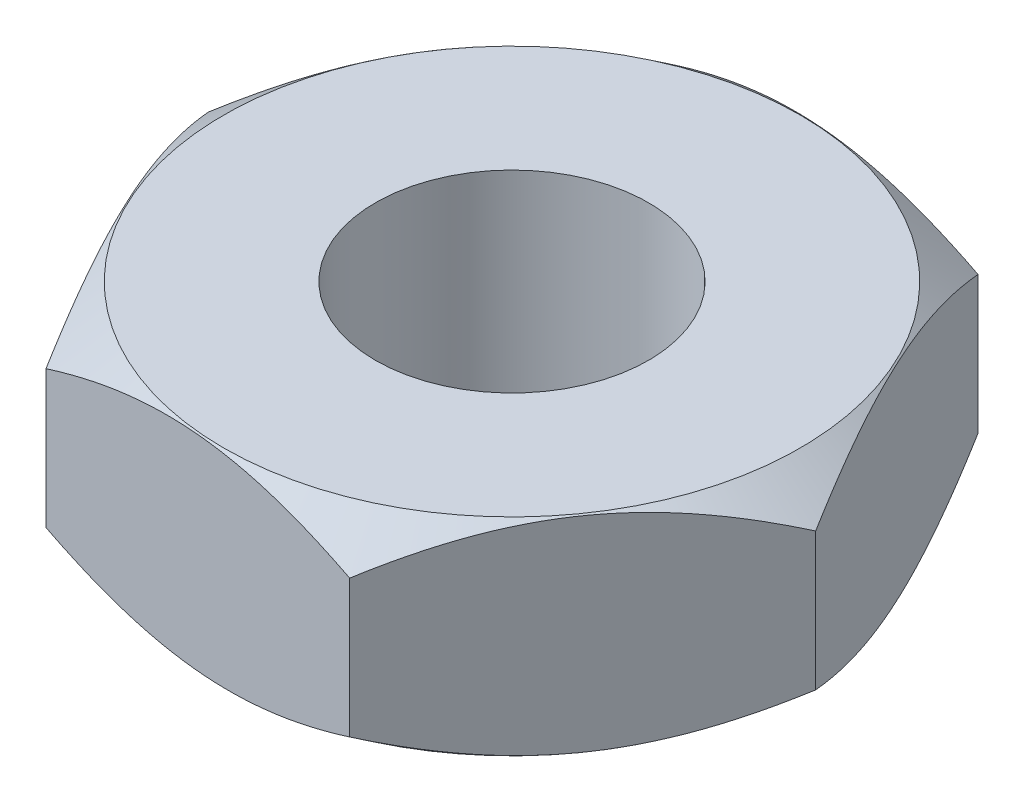
ISO-10303-21;
HEADER;
FILE_DESCRIPTION(('STEP AP214'),'2;1');
FILE_NAME('part.step','',(''),(''),'','','');
FILE_SCHEMA(('AUTOMOTIVE_DESIGN { 1 0 10303 214 1 1 1 1 }'));
ENDSEC;
DATA;
#1=APPLICATION_CONTEXT('core data for automotive mechanical design processes');
#2=APPLICATION_PROTOCOL_DEFINITION('international standard','automotive_design',2000,#1);
#3=PRODUCT_CONTEXT('',#1,'mechanical');
#4=PRODUCT('Part','Part','',(#3));
#5=PRODUCT_RELATED_PRODUCT_CATEGORY('part','',(#4));
#6=PRODUCT_DEFINITION_FORMATION('','',#4);
#7=PRODUCT_DEFINITION_CONTEXT('part definition',#1,'design');
#8=PRODUCT_DEFINITION('design','',#6,#7);
#9=PRODUCT_DEFINITION_SHAPE('','',#8);
#10=(LENGTH_UNIT() NAMED_UNIT(*) SI_UNIT(.MILLI.,.METRE.));
#11=(NAMED_UNIT(*) PLANE_ANGLE_UNIT() SI_UNIT($,.RADIAN.));
#12=(NAMED_UNIT(*) SI_UNIT($,.STERADIAN.) SOLID_ANGLE_UNIT());
#13=UNCERTAINTY_MEASURE_WITH_UNIT(LENGTH_MEASURE(1.E-05),#10,'distance_accuracy_value','');
#14=(GEOMETRIC_REPRESENTATION_CONTEXT(3) GLOBAL_UNCERTAINTY_ASSIGNED_CONTEXT((#13)) GLOBAL_UNIT_ASSIGNED_CONTEXT((#10,
#11,#12)) REPRESENTATION_CONTEXT('',''));
#15=CARTESIAN_POINT('',(0.,0.,0.));
#16=DIRECTION('',(0.,0.,1.));
#17=DIRECTION('',(1.,0.,0.));
#18=AXIS2_PLACEMENT_3D('',#15,#16,#17);
#19=CARTESIAN_POINT('',(3.40734499371523,2.5,7.32962027850947));
#20=DIRECTION('',(-0.818475346561115,0.,-0.574541649553505));
#21=DIRECTION('',(-0.574541649553505,0.,0.818475346561115));
#22=AXIS2_PLACEMENT_3D('',#19,#20,#21);
#23=PLANE('',#22);
#24=CARTESIAN_POINT('',(8.0514502512877,-1.66273053763889,0.713762815239612));
#25=CARTESIAN_POINT('',(7.88019641403909,-1.77446343527246,0.957726057766775));
#26=CARTESIAN_POINT('',(7.70704591768586,-1.8782622042377,1.20439122576648));
#27=CARTESIAN_POINT('',(7.35658310687575,-2.06541723281908,1.70365036695755));
#28=CARTESIAN_POINT('',(7.1792596256447,-2.14870960646448,1.95626024801108));
#29=CARTESIAN_POINT('',(6.82286729872538,-2.28884993232861,2.46396640563029));
#30=CARTESIAN_POINT('',(6.643831838476,-2.34594546032983,2.7190151222694));
#31=CARTESIAN_POINT('',(6.37369059270988,-2.40930570053764,3.10385049481499));
#32=CARTESIAN_POINT('',(6.28341903433959,-2.42670916570008,3.2324487349585));
#33=CARTESIAN_POINT('',(6.10249673979514,-2.45375184515626,3.49018538093183));
#34=CARTESIAN_POINT('',(6.01184605630044,-2.46339210433136,3.619323711716));
#35=CARTESIAN_POINT('',(5.82911458608083,-2.47475479490065,3.87963765680919));
#36=CARTESIAN_POINT('',(5.7370314903531,-2.47636489592613,4.01081656045654));
#37=CARTESIAN_POINT('',(5.55293982232168,-2.4713264553074,4.27306820384588));
#38=CARTESIAN_POINT('',(5.46093125056886,-2.46467785316496,4.40414094280312));
#39=CARTESIAN_POINT('',(5.27718251743575,-2.44327766029834,4.66590405109677));
#40=CARTESIAN_POINT('',(5.18544250594723,-2.42852218494007,4.79659420690173));
#41=CARTESIAN_POINT('',(5.00247965586308,-2.39125597120719,5.05723776902958));
#42=CARTESIAN_POINT('',(4.91125688795054,-2.36874419768933,5.18719107465939));
#43=CARTESIAN_POINT('',(4.63871916450914,-2.29030427125252,5.57544039969618));
#44=CARTESIAN_POINT('',(4.45842199572954,-2.22345735283203,5.83228650966149));
#45=CARTESIAN_POINT('',(4.10151061186007,-2.06552383107109,6.34073210073602));
#46=CARTESIAN_POINT('',(3.92489544405616,-1.97444358417538,6.59233293905401));
#47=CARTESIAN_POINT('',(3.69255100903755,-1.84052134885221,6.92332407280592));
#48=CARTESIAN_POINT('',(3.63514056802983,-1.80626466591005,7.00510931959618));
#49=CARTESIAN_POINT('',(3.52082586776328,-1.73587705774643,7.16795872135914));
#50=CARTESIAN_POINT('',(3.46392083970468,-1.69974991790392,7.24902397154166));
#51=CARTESIAN_POINT('',(3.40720460056791,-1.66273053763889,7.32982027850947));
#52=B_SPLINE_CURVE_WITH_KNOTS('',3,(#24,#25,#26,#27,#28,#29,#30,#31,#32,#33,#34,#35,#36,#37,#38,
#39,#40,#41,#42,#43,#44,#45,#46,#47,#48,#49,#50,#51),.UNSPECIFIED.,.F.,.F.,(4,2,2,2,2,2,2,2,2,2,
2,2,2,4),(0.,0.95530913231467,1.91355782379117,2.86255387843774,3.33663353388783,
3.81064937036481,4.29127776554733,4.77190968154199,5.25277210682606,5.73369873212081,
6.69496390420939,7.65597718290046,7.97286405319337,8.28913293956906),.UNSPECIFIED.);
#53=CARTESIAN_POINT('',(8.05130985814038,-1.66282217350893,0.713962815239612));
#54=VERTEX_POINT('',#53);
#55=CARTESIAN_POINT('',(3.40734499371523,-1.66282217350893,7.32962027850947));
#56=VERTEX_POINT('',#55);
#57=EDGE_CURVE('E56',#54,#56,#52,.T.);
#58=ORIENTED_EDGE('',*,*,#57,.F.);
#59=DIRECTION('',(0.,-1.,0.));
#60=VECTOR('',#59,1.);
#61=CARTESIAN_POINT('',(8.05130985814038,2.5,0.713962815239612));
#62=LINE('',#61,#60);
#63=CARTESIAN_POINT('',(8.05130985814038,1.66282217350893,0.713962815239612));
#64=VERTEX_POINT('',#63);
#65=EDGE_CURVE('E49',#64,#54,#62,.T.);
#66=ORIENTED_EDGE('',*,*,#65,.F.);
#67=CARTESIAN_POINT('',(3.40720460056791,1.66273053763889,7.32982027850947));
#68=CARTESIAN_POINT('',(3.57845843781652,1.77446343527246,7.0858570359823));
#69=CARTESIAN_POINT('',(3.75160893416975,1.8782622042377,6.8391918679826));
#70=CARTESIAN_POINT('',(4.10207174497986,2.06541723281908,6.33993272679153));
#71=CARTESIAN_POINT('',(4.27939522621091,2.14870960646448,6.087322845738));
#72=CARTESIAN_POINT('',(4.63578755313023,2.28884993232861,5.57961668811879));
#73=CARTESIAN_POINT('',(4.81482301337961,2.34594546032983,5.32456797147967));
#74=CARTESIAN_POINT('',(5.08496425914574,2.40930570053764,4.93973259893409));
#75=CARTESIAN_POINT('',(5.17523581751602,2.42670916570008,4.81113435879058));
#76=CARTESIAN_POINT('',(5.35615811206048,2.45375184515626,4.55339771281724));
#77=CARTESIAN_POINT('',(5.44680879555517,2.46339210433136,4.42425938203307));
#78=CARTESIAN_POINT('',(5.62954026577478,2.47475479490065,4.16394543693989));
#79=CARTESIAN_POINT('',(5.72162336150251,2.47636489592613,4.03276653329253));
#80=CARTESIAN_POINT('',(5.90571502953393,2.4713264553074,3.77051488990319));
#81=CARTESIAN_POINT('',(5.99772360128676,2.46467785316496,3.63944215094595));
#82=CARTESIAN_POINT('',(6.18147233441986,2.44327766029834,3.37767904265231));
#83=CARTESIAN_POINT('',(6.27321234590838,2.42852218494007,3.24698888684734));
#84=CARTESIAN_POINT('',(6.45617519599253,2.39125597120719,2.98634532471949));
#85=CARTESIAN_POINT('',(6.54739796390508,2.36874419768933,2.85639201908969));
#86=CARTESIAN_POINT('',(6.81993568734647,2.29030427125252,2.46814269405289));
#87=CARTESIAN_POINT('',(7.00023285612607,2.22345735283203,2.21129658408759));
#88=CARTESIAN_POINT('',(7.35714423999554,2.06552383107109,1.70285099301305));
#89=CARTESIAN_POINT('',(7.53375940779946,1.97444358417538,1.45125015469506));
#90=CARTESIAN_POINT('',(7.76610384281807,1.84052134885221,1.12025902094316));
#91=CARTESIAN_POINT('',(7.82351428382579,1.80626466591005,1.03847377415289));
#92=CARTESIAN_POINT('',(7.93782898409233,1.73587705774644,0.875624372389939));
#93=CARTESIAN_POINT('',(7.99473401215093,1.69974991790392,0.794559122207422));
#94=CARTESIAN_POINT('',(8.0514502512877,1.66273053763889,0.713762815239613));
#95=B_SPLINE_CURVE_WITH_KNOTS('',3,(#67,#68,#69,#70,#71,#72,#73,#74,#75,#76,#77,#78,#79,#80,#81,
#82,#83,#84,#85,#86,#87,#88,#89,#90,#91,#92,#93,#94),.UNSPECIFIED.,.F.,.F.,(4,2,2,2,2,2,2,2,2,2,
2,2,2,4),(0.,0.955309132314671,1.91355782379117,2.86255387843774,3.33663353388783,
3.81064937036482,4.29127776554733,4.771909681542,5.25277210682606,5.73369873212082,
6.6949639042094,7.65597718290047,7.97286405319337,8.28913293956906),.UNSPECIFIED.);
#96=CARTESIAN_POINT('',(3.40734499371523,1.66282217350893,7.32962027850947));
#97=VERTEX_POINT('',#96);
#98=EDGE_CURVE('E174',#97,#64,#95,.T.);
#99=ORIENTED_EDGE('',*,*,#98,.F.);
#100=DIRECTION('',(0.,-1.,0.));
#101=VECTOR('',#100,1.);
#102=CARTESIAN_POINT('',(3.40734499371523,2.5,7.32962027850947));
#103=LINE('',#102,#101);
#104=EDGE_CURVE('E110',#97,#56,#103,.T.);
#105=ORIENTED_EDGE('',*,*,#104,.T.);
#106=EDGE_LOOP('',(#58,#66,#99,#105));
#107=FACE_BOUND('',#106,.T.);
#108=ADVANCED_FACE('F40',(#107),#23,.F.);
#109=CARTESIAN_POINT('',(8.05130985814038,2.5,0.713962815239612));
#110=DIRECTION('',(-0.906805337326109,0.,0.421549617716446));
#111=DIRECTION('',(0.421549617716446,0.,0.906805337326109));
#112=AXIS2_PLACEMENT_3D('',#109,#110,#111);
#113=PLANE('',#112);
#114=CARTESIAN_POINT('',(4.64387188975895,-1.66273946387792,-6.61585746326985));
#115=CARTESIAN_POINT('',(4.76952314301071,-1.77447169895915,-6.34556608521657));
#116=CARTESIAN_POINT('',(4.89656600109973,-1.87826977929504,-6.07228119313591));
#117=CARTESIAN_POINT('',(5.15370528779027,-2.06542339709618,-5.51914280133679));
#118=CARTESIAN_POINT('',(5.28380990950613,-2.14871504907758,-5.2392716772166));
#119=CARTESIAN_POINT('',(5.54529973900327,-2.28885393785498,-4.67677473005058));
#120=CARTESIAN_POINT('',(5.67666045171261,-2.34594874936512,-4.39420159893245));
#121=CARTESIAN_POINT('',(5.87486668002113,-2.40930795106098,-3.96783550068978));
#122=CARTESIAN_POINT('',(5.94110012134438,-2.42671107625242,-3.82535918099401));
#123=CARTESIAN_POINT('',(6.07384520527462,-2.45375309572196,-3.53980809625146));
#124=CARTESIAN_POINT('',(6.14035680923105,-2.4633930348733,-3.39673341434678));
#125=CARTESIAN_POINT('',(6.2744292812909,-2.47475510785177,-3.10832695365311));
#126=CARTESIAN_POINT('',(6.3419918434209,-2.47636491351762,-2.96299153080349));
#127=CARTESIAN_POINT('',(6.4770622828807,-2.47132592208718,-2.67243831886933));
#128=CARTESIAN_POINT('',(6.54457015980628,-2.46467706449165,-2.52722053065432));
#129=CARTESIAN_POINT('',(6.67938897286209,-2.44327640588762,-2.2372085982198));
#130=CARTESIAN_POINT('',(6.74669979901192,-2.42852072024598,-2.09241469058174));
#131=CARTESIAN_POINT('',(6.8809419915655,-2.39125413379618,-1.80364314012613));
#132=CARTESIAN_POINT('',(6.94787330610801,-2.36874219785693,-1.65966560886852));
#133=CARTESIAN_POINT('',(7.14783772001708,-2.29030185903239,-1.22951743606197));
#134=CARTESIAN_POINT('',(7.28012405332108,-2.22345476427954,-0.944953180624642));
#135=CARTESIAN_POINT('',(7.54199449163573,-2.06552106097245,-0.381637496843428));
#136=CARTESIAN_POINT('',(7.67157929568642,-1.97444080902164,-0.102884564777981));
#137=CARTESIAN_POINT('',(7.84205120137609,-1.84052036524651,0.263821577148893));
#138=CARTESIAN_POINT('',(7.88417181465702,-1.80626552787041,0.354428223032001));
#139=CARTESIAN_POINT('',(7.9680416877182,-1.73588180872621,0.534842687513617));
#140=CARTESIAN_POINT('',(8.0097915114898,-1.69975671175042,0.624651719327219));
#141=CARTESIAN_POINT('',(8.05140283280658,-1.66273946387792,0.714162815239612));
#142=B_SPLINE_CURVE_WITH_KNOTS('',3,(#114,#115,#116,#117,#118,#119,#120,#121,#122,#123,#124,
#125,#126,#127,#128,#129,#130,#131,#132,#133,#134,#135,#136,#137,#138,#139,#140,#141),
.UNSPECIFIED.,.F.,.F.,(4,2,2,2,2,2,2,2,2,2,2,2,2,4),(0.,0.955307141932442,1.91355381046055,
2.86254790318337,3.33662658155427,3.81064144141715,4.2912687402959,4.77189956005428,
5.2527608898098,5.73368641907198,6.69494936078008,7.65596040161594,7.97283021351268,
8.28908210533192),.UNSPECIFIED.);
#143=CARTESIAN_POINT('',(4.64396486442515,-1.66282217350893,-6.61565746326985));
#144=VERTEX_POINT('',#143);
#145=EDGE_CURVE('E188',#144,#54,#142,.T.);
#146=ORIENTED_EDGE('',*,*,#145,.F.);
#147=DIRECTION('',(0.,-1.,0.));
#148=VECTOR('',#147,1.);
#149=CARTESIAN_POINT('',(4.64396486442515,2.5,-6.61565746326985));
#150=LINE('',#149,#148);
#151=CARTESIAN_POINT('',(4.64396486442515,1.66282217350893,-6.61565746326985));
#152=VERTEX_POINT('',#151);
#153=EDGE_CURVE('E120',#152,#144,#150,.T.);
#154=ORIENTED_EDGE('',*,*,#153,.F.);
#155=CARTESIAN_POINT('',(8.05140283280658,1.66273946387792,0.714162815239612));
#156=CARTESIAN_POINT('',(7.92575157955481,1.77447169895915,0.443871437186323));
#157=CARTESIAN_POINT('',(7.7987087214658,1.87826977929505,0.170586545105668));
#158=CARTESIAN_POINT('',(7.54156943477526,2.06542339709618,-0.382551846693458));
#159=CARTESIAN_POINT('',(7.4114648130594,2.14871504907758,-0.662422970813643));
#160=CARTESIAN_POINT('',(7.14997498356226,2.28885393785498,-1.22491991797966));
#161=CARTESIAN_POINT('',(7.01861427085292,2.34594874936512,-1.5074930490978));
#162=CARTESIAN_POINT('',(6.82040804254439,2.40930795106099,-1.93385914734046));
#163=CARTESIAN_POINT('',(6.75417460122115,2.42671107625242,-2.07633546703623));
#164=CARTESIAN_POINT('',(6.62142951729091,2.45375309572196,-2.36188655177878));
#165=CARTESIAN_POINT('',(6.55491791333447,2.4633930348733,-2.50496123368346));
#166=CARTESIAN_POINT('',(6.42084544127463,2.47475510785177,-2.79336769437714));
#167=CARTESIAN_POINT('',(6.35328287914462,2.47636491351762,-2.93870311722676));
#168=CARTESIAN_POINT('',(6.21821243968482,2.47132592208718,-3.22925632916092));
#169=CARTESIAN_POINT('',(6.15070456275925,2.46467706449165,-3.37447411737592));
#170=CARTESIAN_POINT('',(6.01588574970344,2.44327640588762,-3.66448604981045));
#171=CARTESIAN_POINT('',(5.94857492355361,2.42852072024598,-3.8092799574485));
#172=CARTESIAN_POINT('',(5.81433273100003,2.39125413379618,-4.09805150790411));
#173=CARTESIAN_POINT('',(5.74740141645752,2.36874219785693,-4.24202903916172));
#174=CARTESIAN_POINT('',(5.54743700254845,2.29030185903239,-4.67217721196828));
#175=CARTESIAN_POINT('',(5.41515066924445,2.22345476427954,-4.9567414674056));
#176=CARTESIAN_POINT('',(5.1532802309298,2.06552106097245,-5.52005715118682));
#177=CARTESIAN_POINT('',(5.02369542687911,1.97444080902164,-5.79881008325227));
#178=CARTESIAN_POINT('',(4.85322352118943,1.84052036524651,-6.16551622517914));
#179=CARTESIAN_POINT('',(4.81110290790851,1.8062655278704,-6.25612287106225));
#180=CARTESIAN_POINT('',(4.72723303484733,1.73588180872621,-6.43653733554386));
#181=CARTESIAN_POINT('',(4.68548321107573,1.69975671175042,-6.52634636735746));
#182=CARTESIAN_POINT('',(4.64387188975895,1.66273946387792,-6.61585746326985));
#183=B_SPLINE_CURVE_WITH_KNOTS('',3,(#155,#156,#157,#158,#159,#160,#161,#162,#163,#164,#165,
#166,#167,#168,#169,#170,#171,#172,#173,#174,#175,#176,#177,#178,#179,#180,#181,#182),
.UNSPECIFIED.,.F.,.F.,(4,2,2,2,2,2,2,2,2,2,2,2,2,4),(0.,0.955307141932444,1.91355381046055,
2.86254790318338,3.33662658155427,3.81064144141715,4.2912687402959,4.77189956005428,
5.2527608898098,5.73368641907198,6.69494936078009,7.65596040161595,7.97283021351269,
8.28908210533192),.UNSPECIFIED.);
#184=EDGE_CURVE('E169',#64,#152,#183,.T.);
#185=ORIENTED_EDGE('',*,*,#184,.F.);
#186=ORIENTED_EDGE('',*,*,#65,.T.);
#187=EDGE_LOOP('',(#146,#154,#185,#186));
#188=FACE_BOUND('',#187,.T.);
#189=ADVANCED_FACE('F180',(#188),#113,.F.);
#190=CARTESIAN_POINT('',(4.64396486442515,2.5,-6.61565746326985));
#191=DIRECTION('',(-0.0883299907649943,0.,0.996091267269951));
#192=DIRECTION('',(0.996091267269951,0.,0.0883299907649943));
#193=AXIS2_PLACEMENT_3D('',#190,#191,#192);
#194=PLANE('',#193);
#195=CARTESIAN_POINT('',(-3.40754499371523,-1.66274687780085,-7.32963801383025));
#196=CARTESIAN_POINT('',(-3.11064054750935,-1.77447856257912,-7.3033095358552));
#197=CARTESIAN_POINT('',(-2.81044784304438,-1.87827607095302,-7.27668946630497));
#198=CARTESIAN_POINT('',(-2.20284709985687,-2.06542851698825,-7.22280949586646));
#199=CARTESIAN_POINT('',(-1.89541970161603,-2.14871956957011,-7.19554787824186));
#200=CARTESIAN_POINT('',(-1.27753899911836,-2.28885726473307,-7.14075631592341));
#201=CARTESIAN_POINT('',(-0.967143574330733,-2.34595148114091,-7.11323150378432));
#202=CARTESIAN_POINT('',(-0.498797289823525,-2.40930982027138,-7.07170014582079));
#203=CARTESIAN_POINT('',(-0.342292696968079,-2.4267126630904,-7.05782185003019));
#204=CARTESIAN_POINT('',(-0.0286261555177719,-2.45375413438985,-7.03000696637447));
#205=CARTESIAN_POINT('',(0.128535701750904,-2.46339380773675,-7.01607038660784));
#206=CARTESIAN_POINT('',(0.445338705432133,-2.47475536775868,-6.98797737213319));
#207=CARTESIAN_POINT('',(0.604983854466522,-2.47636492810586,-6.97382058248627));
#208=CARTESIAN_POINT('',(0.924144924779663,-2.47132547918452,-6.94551846267091));
#209=CARTESIAN_POINT('',(1.08366084510316,-2.46467640941592,-6.93137313258719));
#210=CARTESIAN_POINT('',(1.40222732069387,-2.44327536398201,-6.90312373941252));
#211=CARTESIAN_POINT('',(1.56127761608014,-2.42851950368433,-6.88901969936693));
#212=CARTESIAN_POINT('',(1.87848156615004,-2.39125260766544,-6.86089113032818));
#213=CARTESIAN_POINT('',(2.03663509828926,-2.36874053682323,-6.84686661220185));
#214=CARTESIAN_POINT('',(2.5091355633853,-2.2902998554805,-6.80496687561167));
#215=CARTESIAN_POINT('',(2.82171794011343,-2.22345261427107,-6.77724813200159));
#216=CARTESIAN_POINT('',(3.44049754063646,-2.06551876017769,-6.72237685845899));
#217=CARTESIAN_POINT('',(3.74669641625132,-1.97443850402898,-6.69522418204868));
#218=CARTESIAN_POINT('',(4.1495040871214,-1.84051954828221,-6.6595045657674));
#219=CARTESIAN_POINT('',(4.24902760047687,-1.80626624379524,-6.65067915859393));
#220=CARTESIAN_POINT('',(4.4471972231511,-1.73588575478284,-6.63310614945724));
#221=CARTESIAN_POINT('',(4.54584466496735,-1.69976235456249,-6.62435842933265));
#222=CARTESIAN_POINT('',(4.64416486442515,-1.66274687780086,-6.61563972794907));
#223=B_SPLINE_CURVE_WITH_KNOTS('',3,(#195,#196,#197,#198,#199,#200,#201,#202,#203,#204,#205,
#206,#207,#208,#209,#210,#211,#212,#213,#214,#215,#216,#217,#218,#219,#220,#221,#222),
.UNSPECIFIED.,.F.,.F.,(4,2,2,2,2,2,2,2,2,2,2,2,2,4),(0.,0.955305488762649,1.91355047707196,
2.86254294026276,3.33662080709258,3.81063485580068,4.29126124411332,4.77189115336163,
5.25275157319488,5.73367619211612,6.69493728131803,7.65594646343942,7.97280210698136,
8.28903988346751),.UNSPECIFIED.);
#224=CARTESIAN_POINT('',(-3.40734499371523,-1.66282217350892,-7.32962027850947));
#225=VERTEX_POINT('',#224);
#226=EDGE_CURVE('E194',#225,#144,#223,.T.);
#227=ORIENTED_EDGE('',*,*,#226,.F.);
#228=DIRECTION('',(0.,-1.,0.));
#229=VECTOR('',#228,1.);
#230=CARTESIAN_POINT('',(-3.40734499371523,2.5,-7.32962027850947));
#231=LINE('',#230,#229);
#232=CARTESIAN_POINT('',(-3.40734499371523,1.66282217350892,-7.32962027850947));
#233=VERTEX_POINT('',#232);
#234=EDGE_CURVE('E112',#233,#225,#231,.T.);
#235=ORIENTED_EDGE('',*,*,#234,.F.);
#236=CARTESIAN_POINT('',(4.64416486442515,1.66274687780086,-6.61563972794907));
#237=CARTESIAN_POINT('',(4.34726041821926,1.77447856257912,-6.64196820592412));
#238=CARTESIAN_POINT('',(4.0470677137543,1.87827607095303,-6.66858827547435));
#239=CARTESIAN_POINT('',(3.43946697056678,2.06542851698825,-6.72246824591286));
#240=CARTESIAN_POINT('',(3.13203957232594,2.14871956957012,-6.74972986353746));
#241=CARTESIAN_POINT('',(2.51415886982828,2.28885726473307,-6.80452142585591));
#242=CARTESIAN_POINT('',(2.20376344504065,2.34595148114091,-6.832046237995));
#243=CARTESIAN_POINT('',(1.73541716053344,2.40930982027138,-6.87357759595853));
#244=CARTESIAN_POINT('',(1.57891256767799,2.4267126630904,-6.88745589174913));
#245=CARTESIAN_POINT('',(1.26524602622768,2.45375413438985,-6.91527077540485));
#246=CARTESIAN_POINT('',(1.10808416895901,2.46339380773675,-6.92920735517148));
#247=CARTESIAN_POINT('',(0.79128116527778,2.47475536775868,-6.95730036964613));
#248=CARTESIAN_POINT('',(0.631636016243392,2.47636492810586,-6.97145715929306));
#249=CARTESIAN_POINT('',(0.31247494593025,2.47132547918452,-6.99975927910841));
#250=CARTESIAN_POINT('',(0.152959025606751,2.46467640941592,-7.01390460919213));
#251=CARTESIAN_POINT('',(-0.165607449983955,2.44327536398201,-7.0421540023668));
#252=CARTESIAN_POINT('',(-0.324657745370224,2.42851950368433,-7.05625804241239));
#253=CARTESIAN_POINT('',(-0.641861695440124,2.39125260766544,-7.08438661145114));
#254=CARTESIAN_POINT('',(-0.800015227579343,2.36874053682323,-7.09841112957747));
#255=CARTESIAN_POINT('',(-1.27251569267538,2.2902998554805,-7.14031086616765));
#256=CARTESIAN_POINT('',(-1.58509806940352,2.22345261427107,-7.16802960977773));
#257=CARTESIAN_POINT('',(-2.20387766992655,2.06551876017769,-7.22290088332033));
#258=CARTESIAN_POINT('',(-2.5100765455414,1.97443850402898,-7.25005355973064));
#259=CARTESIAN_POINT('',(-2.91288421641149,1.84051954828221,-7.28577317601192));
#260=CARTESIAN_POINT('',(-3.01240772976695,1.80626624379524,-7.29459858318539));
#261=CARTESIAN_POINT('',(-3.21057735244119,1.73588575478283,-7.31217159232208));
#262=CARTESIAN_POINT('',(-3.30922479425743,1.69976235456248,-7.32091931244667));
#263=CARTESIAN_POINT('',(-3.40754499371523,1.66274687780086,-7.32963801383025));
#264=B_SPLINE_CURVE_WITH_KNOTS('',3,(#236,#237,#238,#239,#240,#241,#242,#243,#244,#245,#246,
#247,#248,#249,#250,#251,#252,#253,#254,#255,#256,#257,#258,#259,#260,#261,#262,#263),
.UNSPECIFIED.,.F.,.F.,(4,2,2,2,2,2,2,2,2,2,2,2,2,4),(0.,0.95530548876265,1.91355047707196,
2.86254294026276,3.33662080709258,3.81063485580067,4.29126124411332,4.77189115336163,
5.25275157319487,5.73367619211612,6.69493728131803,7.65594646343942,7.97280210698136,
8.28903988346751),.UNSPECIFIED.);
#265=EDGE_CURVE('E162',#152,#233,#264,.T.);
#266=ORIENTED_EDGE('',*,*,#265,.F.);
#267=ORIENTED_EDGE('',*,*,#153,.T.);
#268=EDGE_LOOP('',(#227,#235,#266,#267));
#269=FACE_BOUND('',#268,.T.);
#270=ADVANCED_FACE('F183',(#269),#194,.F.);
#271=CARTESIAN_POINT('',(-3.40734499371523,2.5,-7.32962027850947));
#272=DIRECTION('',(0.818475346561115,0.,0.574541649553505));
#273=DIRECTION('',(0.574541649553505,0.,-0.818475346561115));
#274=AXIS2_PLACEMENT_3D('',#271,#272,#273);
#275=PLANE('',#274);
#276=CARTESIAN_POINT('',(-8.05145025128771,-1.66273053763889,-0.71376281523961));
#277=CARTESIAN_POINT('',(-7.8801964140391,-1.77446343527246,-0.957726057766774));
#278=CARTESIAN_POINT('',(-7.70704591768587,-1.8782622042377,-1.20439122576648));
#279=CARTESIAN_POINT('',(-7.35658310687576,-2.06541723281907,-1.70365036695755));
#280=CARTESIAN_POINT('',(-7.1792596256447,-2.14870960646448,-1.95626024801108));
#281=CARTESIAN_POINT('',(-6.82286729872538,-2.28884993232861,-2.46396640563029));
#282=CARTESIAN_POINT('',(-6.643831838476,-2.34594546032983,-2.71901512226941));
#283=CARTESIAN_POINT('',(-6.37369059270988,-2.40930570053763,-3.10385049481499));
#284=CARTESIAN_POINT('',(-6.2834190343396,-2.42670916570008,-3.2324487349585));
#285=CARTESIAN_POINT('',(-6.10249673979514,-2.45375184515626,-3.49018538093183));
#286=CARTESIAN_POINT('',(-6.01184605630044,-2.46339210433136,-3.619323711716));
#287=CARTESIAN_POINT('',(-5.82911458608083,-2.47475479490064,-3.87963765680919));
#288=CARTESIAN_POINT('',(-5.7370314903531,-2.47636489592612,-4.01081656045654));
#289=CARTESIAN_POINT('',(-5.55293982232169,-2.4713264553074,-4.27306820384588));
#290=CARTESIAN_POINT('',(-5.46093125056886,-2.46467785316496,-4.40414094280312));
#291=CARTESIAN_POINT('',(-5.27718251743576,-2.44327766029834,-4.66590405109677));
#292=CARTESIAN_POINT('',(-5.18544250594723,-2.42852218494006,-4.79659420690173));
#293=CARTESIAN_POINT('',(-5.00247965586308,-2.39125597120719,-5.05723776902958));
#294=CARTESIAN_POINT('',(-4.91125688795054,-2.36874419768933,-5.18719107465939));
#295=CARTESIAN_POINT('',(-4.63871916450914,-2.29030427125252,-5.57544039969618));
#296=CARTESIAN_POINT('',(-4.45842199572955,-2.22345735283203,-5.83228650966149));
#297=CARTESIAN_POINT('',(-4.10151061186008,-2.06552383107108,-6.34073210073603));
#298=CARTESIAN_POINT('',(-3.92489544405616,-1.97444358417538,-6.59233293905401));
#299=CARTESIAN_POINT('',(-3.69255100903755,-1.84052134885221,-6.92332407280592));
#300=CARTESIAN_POINT('',(-3.63514056802983,-1.80626466591004,-7.00510931959618));
#301=CARTESIAN_POINT('',(-3.52082586776328,-1.73587705774643,-7.16795872135914));
#302=CARTESIAN_POINT('',(-3.46392083970468,-1.69974991790392,-7.24902397154166));
#303=CARTESIAN_POINT('',(-3.40720460056791,-1.66273053763889,-7.32982027850947));
#304=B_SPLINE_CURVE_WITH_KNOTS('',3,(#276,#277,#278,#279,#280,#281,#282,#283,#284,#285,#286,
#287,#288,#289,#290,#291,#292,#293,#294,#295,#296,#297,#298,#299,#300,#301,#302,#303),
.UNSPECIFIED.,.F.,.F.,(4,2,2,2,2,2,2,2,2,2,2,2,2,4),(0.,0.955309132314672,1.91355782379117,
2.86255387843774,3.33663353388783,3.81064937036481,4.29127776554733,4.77190968154199,
5.25277210682606,5.73369873212081,6.6949639042094,7.65597718290046,7.97286405319337,
8.28913293956906),.UNSPECIFIED.);
#305=CARTESIAN_POINT('',(-8.05130985814039,-1.66282217350892,-0.71396281523961));
#306=VERTEX_POINT('',#305);
#307=EDGE_CURVE('E107',#306,#225,#304,.T.);
#308=ORIENTED_EDGE('',*,*,#307,.F.);
#309=DIRECTION('',(0.,-1.,0.));
#310=VECTOR('',#309,1.);
#311=CARTESIAN_POINT('',(-8.05130985814039,2.5,-0.71396281523961));
#312=LINE('',#311,#310);
#313=CARTESIAN_POINT('',(-8.05130985814039,1.66282217350892,-0.71396281523961));
#314=VERTEX_POINT('',#313);
#315=EDGE_CURVE('E106',#314,#306,#312,.T.);
#316=ORIENTED_EDGE('',*,*,#315,.F.);
#317=CARTESIAN_POINT('',(-3.40720460056791,1.66273053763889,-7.32982027850947));
#318=CARTESIAN_POINT('',(-3.57845843781652,1.77446343527246,-7.0858570359823));
#319=CARTESIAN_POINT('',(-3.75160893416975,1.8782622042377,-6.8391918679826));
#320=CARTESIAN_POINT('',(-4.10207174497986,2.06541723281907,-6.33993272679153));
#321=CARTESIAN_POINT('',(-4.27939522621091,2.14870960646448,-6.087322845738));
#322=CARTESIAN_POINT('',(-4.63578755313023,2.28884993232861,-5.57961668811879));
#323=CARTESIAN_POINT('',(-4.81482301337962,2.34594546032983,-5.32456797147967));
#324=CARTESIAN_POINT('',(-5.08496425914574,2.40930570053763,-4.93973259893409));
#325=CARTESIAN_POINT('',(-5.17523581751602,2.42670916570008,-4.81113435879058));
#326=CARTESIAN_POINT('',(-5.35615811206048,2.45375184515626,-4.55339771281724));
#327=CARTESIAN_POINT('',(-5.44680879555517,2.46339210433136,-4.42425938203307));
#328=CARTESIAN_POINT('',(-5.62954026577479,2.47475479490064,-4.16394543693989));
#329=CARTESIAN_POINT('',(-5.72162336150252,2.47636489592612,-4.03276653329253));
#330=CARTESIAN_POINT('',(-5.90571502953393,2.4713264553074,-3.7705148899032));
#331=CARTESIAN_POINT('',(-5.99772360128676,2.46467785316496,-3.63944215094595));
#332=CARTESIAN_POINT('',(-6.18147233441986,2.44327766029834,-3.37767904265231));
#333=CARTESIAN_POINT('',(-6.27321234590839,2.42852218494006,-3.24698888684734));
#334=CARTESIAN_POINT('',(-6.45617519599254,2.39125597120718,-2.9863453247195));
#335=CARTESIAN_POINT('',(-6.54739796390508,2.36874419768933,-2.85639201908969));
#336=CARTESIAN_POINT('',(-6.81993568734647,2.29030427125252,-2.46814269405289));
#337=CARTESIAN_POINT('',(-7.00023285612607,2.22345735283203,-2.21129658408759));
#338=CARTESIAN_POINT('',(-7.35714423999554,2.06552383107108,-1.70285099301305));
#339=CARTESIAN_POINT('',(-7.53375940779946,1.97444358417538,-1.45125015469506));
#340=CARTESIAN_POINT('',(-7.76610384281807,1.84052134885221,-1.12025902094316));
#341=CARTESIAN_POINT('',(-7.82351428382579,1.80626466591004,-1.03847377415289));
#342=CARTESIAN_POINT('',(-7.93782898409234,1.73587705774643,-0.875624372389938));
#343=CARTESIAN_POINT('',(-7.99473401215093,1.69974991790392,-0.79455912220742));
#344=CARTESIAN_POINT('',(-8.05145025128771,1.66273053763889,-0.71376281523961));
#345=B_SPLINE_CURVE_WITH_KNOTS('',3,(#317,#318,#319,#320,#321,#322,#323,#324,#325,#326,#327,
#328,#329,#330,#331,#332,#333,#334,#335,#336,#337,#338,#339,#340,#341,#342,#343,#344),
.UNSPECIFIED.,.F.,.F.,(4,2,2,2,2,2,2,2,2,2,2,2,2,4),(0.,0.955309132314672,1.91355782379117,
2.86255387843774,3.33663353388784,3.81064937036482,4.29127776554733,4.771909681542,
5.25277210682606,5.73369873212082,6.6949639042094,7.65597718290047,7.97286405319337,
8.28913293956906),.UNSPECIFIED.);
#346=EDGE_CURVE('E155',#233,#314,#345,.T.);
#347=ORIENTED_EDGE('',*,*,#346,.F.);
#348=ORIENTED_EDGE('',*,*,#234,.T.);
#349=EDGE_LOOP('',(#308,#316,#347,#348));
#350=FACE_BOUND('',#349,.T.);
#351=ADVANCED_FACE('F211',(#350),#275,.F.);
#352=CARTESIAN_POINT('',(-8.05130985814039,2.5,-0.71396281523961));
#353=DIRECTION('',(0.906805337326109,0.,-0.421549617716446));
#354=DIRECTION('',(-0.421549617716446,0.,-0.906805337326109));
#355=AXIS2_PLACEMENT_3D('',#352,#353,#354);
#356=PLANE('',#355);
#357=CARTESIAN_POINT('',(-4.64387188975896,-1.66273946387792,6.61585746326985));
#358=CARTESIAN_POINT('',(-4.76952314301072,-1.77447169895915,6.34556608521656));
#359=CARTESIAN_POINT('',(-4.89656600109973,-1.87826977929504,6.07228119313591));
#360=CARTESIAN_POINT('',(-5.15370528779028,-2.06542339709618,5.51914280133678));
#361=CARTESIAN_POINT('',(-5.28380990950614,-2.14871504907757,5.2392716772166));
#362=CARTESIAN_POINT('',(-5.54529973900328,-2.28885393785498,4.67677473005058));
#363=CARTESIAN_POINT('',(-5.67666045171261,-2.34594874936512,4.39420159893244));
#364=CARTESIAN_POINT('',(-5.87486668002114,-2.40930795106098,3.96783550068978));
#365=CARTESIAN_POINT('',(-5.94110012134439,-2.42671107625241,3.82535918099401));
#366=CARTESIAN_POINT('',(-6.07384520527462,-2.45375309572195,3.53980809625146));
#367=CARTESIAN_POINT('',(-6.14035680923106,-2.4633930348733,3.39673341434678));
#368=CARTESIAN_POINT('',(-6.27442928129091,-2.47475510785177,3.1083269536531));
#369=CARTESIAN_POINT('',(-6.34199184342091,-2.47636491351762,2.96299153080348));
#370=CARTESIAN_POINT('',(-6.47706228288071,-2.47132592208718,2.67243831886932));
#371=CARTESIAN_POINT('',(-6.54457015980629,-2.46467706449164,2.52722053065431));
#372=CARTESIAN_POINT('',(-6.6793889728621,-2.44327640588762,2.23720859821979));
#373=CARTESIAN_POINT('',(-6.74669979901192,-2.42852072024598,2.09241469058174));
#374=CARTESIAN_POINT('',(-6.88094199156551,-2.39125413379618,1.80364314012613));
#375=CARTESIAN_POINT('',(-6.94787330610802,-2.36874219785693,1.65966560886852));
#376=CARTESIAN_POINT('',(-7.14783772001709,-2.29030185903239,1.22951743606196));
#377=CARTESIAN_POINT('',(-7.28012405332109,-2.22345476427954,0.944953180624638));
#378=CARTESIAN_POINT('',(-7.54199449163574,-2.06552106097244,0.381637496843423));
#379=CARTESIAN_POINT('',(-7.67157929568643,-1.97444080902164,0.102884564777976));
#380=CARTESIAN_POINT('',(-7.8420512013761,-1.84052036524651,-0.263821577148897));
#381=CARTESIAN_POINT('',(-7.88417181465703,-1.8062655278704,-0.354428223032005));
#382=CARTESIAN_POINT('',(-7.96804168771821,-1.73588180872621,-0.534842687513618));
#383=CARTESIAN_POINT('',(-8.0097915114898,-1.69975671175042,-0.624651719327219));
#384=CARTESIAN_POINT('',(-8.05140283280658,-1.66273946387792,-0.714162815239611));
#385=B_SPLINE_CURVE_WITH_KNOTS('',3,(#357,#358,#359,#360,#361,#362,#363,#364,#365,#366,#367,
#368,#369,#370,#371,#372,#373,#374,#375,#376,#377,#378,#379,#380,#381,#382,#383,#384),
.UNSPECIFIED.,.F.,.F.,(4,2,2,2,2,2,2,2,2,2,2,2,2,4),(0.,0.955307141932443,1.91355381046055,
2.86254790318338,3.33662658155427,3.81064144141715,4.2912687402959,4.77189956005428,
5.2527608898098,5.73368641907198,6.69494936078009,7.65596040161595,7.97283021351268,
8.28908210533191),.UNSPECIFIED.);
#386=CARTESIAN_POINT('',(-4.64396486442515,-1.66282217350892,6.61565746326985));
#387=VERTEX_POINT('',#386);
#388=EDGE_CURVE('E93',#387,#306,#385,.T.);
#389=ORIENTED_EDGE('',*,*,#388,.F.);
#390=DIRECTION('',(0.,-1.,0.));
#391=VECTOR('',#390,1.);
#392=CARTESIAN_POINT('',(-4.64396486442515,2.5,6.61565746326985));
#393=LINE('',#392,#391);
#394=CARTESIAN_POINT('',(-4.64396486442515,1.66282217350892,6.61565746326985));
#395=VERTEX_POINT('',#394);
#396=EDGE_CURVE('E104',#395,#387,#393,.T.);
#397=ORIENTED_EDGE('',*,*,#396,.F.);
#398=CARTESIAN_POINT('',(-8.05140283280658,1.66273946387791,-0.714162815239611));
#399=CARTESIAN_POINT('',(-7.92575157955482,1.77447169895915,-0.443871437186322));
#400=CARTESIAN_POINT('',(-7.79870872146581,1.87826977929504,-0.170586545105667));
#401=CARTESIAN_POINT('',(-7.54156943477526,2.06542339709618,0.382551846693458));
#402=CARTESIAN_POINT('',(-7.41146481305941,2.14871504907757,0.662422970813643));
#403=CARTESIAN_POINT('',(-7.14997498356226,2.28885393785498,1.22491991797966));
#404=CARTESIAN_POINT('',(-7.01861427085293,2.34594874936512,1.5074930490978));
#405=CARTESIAN_POINT('',(-6.8204080425444,2.40930795106098,1.93385914734046));
#406=CARTESIAN_POINT('',(-6.75417460122115,2.42671107625241,2.07633546703623));
#407=CARTESIAN_POINT('',(-6.62142951729092,2.45375309572195,2.36188655177878));
#408=CARTESIAN_POINT('',(-6.55491791333448,2.4633930348733,2.50496123368346));
#409=CARTESIAN_POINT('',(-6.42084544127463,2.47475510785177,2.79336769437714));
#410=CARTESIAN_POINT('',(-6.35328287914463,2.47636491351762,2.93870311722676));
#411=CARTESIAN_POINT('',(-6.21821243968483,2.47132592208718,3.22925632916092));
#412=CARTESIAN_POINT('',(-6.15070456275925,2.46467706449164,3.37447411737593));
#413=CARTESIAN_POINT('',(-6.01588574970344,2.44327640588762,3.66448604981045));
#414=CARTESIAN_POINT('',(-5.94857492355362,2.42852072024598,3.8092799574485));
#415=CARTESIAN_POINT('',(-5.81433273100004,2.39125413379618,4.09805150790411));
#416=CARTESIAN_POINT('',(-5.74740141645752,2.36874219785693,4.24202903916172));
#417=CARTESIAN_POINT('',(-5.54743700254845,2.29030185903239,4.67217721196828));
#418=CARTESIAN_POINT('',(-5.41515066924445,2.22345476427954,4.9567414674056));
#419=CARTESIAN_POINT('',(-5.15328023092981,2.06552106097244,5.52005715118682));
#420=CARTESIAN_POINT('',(-5.02369542687911,1.97444080902164,5.79881008325226));
#421=CARTESIAN_POINT('',(-4.85322352118944,1.84052036524651,6.16551622517914));
#422=CARTESIAN_POINT('',(-4.81110290790851,1.8062655278704,6.25612287106225));
#423=CARTESIAN_POINT('',(-4.72723303484733,1.73588180872621,6.43653733554386));
#424=CARTESIAN_POINT('',(-4.68548321107574,1.69975671175042,6.52634636735746));
#425=CARTESIAN_POINT('',(-4.64387188975896,1.66273946387792,6.61585746326985));
#426=B_SPLINE_CURVE_WITH_KNOTS('',3,(#398,#399,#400,#401,#402,#403,#404,#405,#406,#407,#408,
#409,#410,#411,#412,#413,#414,#415,#416,#417,#418,#419,#420,#421,#422,#423,#424,#425),
.UNSPECIFIED.,.F.,.F.,(4,2,2,2,2,2,2,2,2,2,2,2,2,4),(0.,0.955307141932443,1.91355381046055,
2.86254790318338,3.33662658155427,3.81064144141715,4.2912687402959,4.77189956005428,
5.2527608898098,5.73368641907198,6.69494936078008,7.65596040161595,7.97283021351268,
8.28908210533192),.UNSPECIFIED.);
#427=EDGE_CURVE('E63',#314,#395,#426,.T.);
#428=ORIENTED_EDGE('',*,*,#427,.F.);
#429=ORIENTED_EDGE('',*,*,#315,.T.);
#430=EDGE_LOOP('',(#389,#397,#428,#429));
#431=FACE_BOUND('',#430,.T.);
#432=ADVANCED_FACE('F103',(#431),#356,.F.);
#433=CARTESIAN_POINT('',(-4.64396486442515,2.5,6.61565746326985));
#434=DIRECTION('',(0.0883299907649943,0.,-0.996091267269951));
#435=DIRECTION('',(-0.996091267269951,0.,-0.0883299907649943));
#436=AXIS2_PLACEMENT_3D('',#433,#434,#435);
#437=PLANE('',#436);
#438=CARTESIAN_POINT('',(3.40754499371523,-1.66274687780086,7.32963801383025));
#439=CARTESIAN_POINT('',(3.11064054750935,-1.77447856257912,7.3033095358552));
#440=CARTESIAN_POINT('',(2.81044784304438,-1.87827607095303,7.27668946630497));
#441=CARTESIAN_POINT('',(2.20284709985686,-2.06542851698825,7.22280949586646));
#442=CARTESIAN_POINT('',(1.89541970161602,-2.14871956957011,7.19554787824186));
#443=CARTESIAN_POINT('',(1.27753899911836,-2.28885726473307,7.14075631592341));
#444=CARTESIAN_POINT('',(0.96714357433073,-2.34595148114091,7.11323150378432));
#445=CARTESIAN_POINT('',(0.498797289823522,-2.40930982027138,7.07170014582079));
#446=CARTESIAN_POINT('',(0.342292696968076,-2.4267126630904,7.05782185003019));
#447=CARTESIAN_POINT('',(0.0286261555177686,-2.45375413438985,7.03000696637447));
#448=CARTESIAN_POINT('',(-0.128535701750907,-2.46339380773675,7.01607038660784));
#449=CARTESIAN_POINT('',(-0.445338705432137,-2.47475536775868,6.98797737213319));
#450=CARTESIAN_POINT('',(-0.604983854466525,-2.47636492810586,6.97382058248626));
#451=CARTESIAN_POINT('',(-0.924144924779667,-2.47132547918452,6.94551846267091));
#452=CARTESIAN_POINT('',(-1.08366084510317,-2.46467640941592,6.93137313258719));
#453=CARTESIAN_POINT('',(-1.40222732069387,-2.44327536398201,6.90312373941252));
#454=CARTESIAN_POINT('',(-1.56127761608014,-2.42851950368433,6.88901969936693));
#455=CARTESIAN_POINT('',(-1.87848156615004,-2.39125260766544,6.86089113032818));
#456=CARTESIAN_POINT('',(-2.03663509828926,-2.36874053682323,6.84686661220185));
#457=CARTESIAN_POINT('',(-2.5091355633853,-2.2902998554805,6.80496687561167));
#458=CARTESIAN_POINT('',(-2.82171794011344,-2.22345261427107,6.77724813200159));
#459=CARTESIAN_POINT('',(-3.44049754063646,-2.06551876017769,6.72237685845899));
#460=CARTESIAN_POINT('',(-3.74669641625132,-1.97443850402898,6.69522418204868));
#461=CARTESIAN_POINT('',(-4.14950408712141,-1.84051954828221,6.65950456576739));
#462=CARTESIAN_POINT('',(-4.24902760047687,-1.80626624379524,6.65067915859393));
#463=CARTESIAN_POINT('',(-4.44719722315111,-1.73588575478283,6.63310614945724));
#464=CARTESIAN_POINT('',(-4.54584466496735,-1.69976235456248,6.62435842933265));
#465=CARTESIAN_POINT('',(-4.64416486442515,-1.66274687780086,6.61563972794907));
#466=B_SPLINE_CURVE_WITH_KNOTS('',3,(#438,#439,#440,#441,#442,#443,#444,#445,#446,#447,#448,
#449,#450,#451,#452,#453,#454,#455,#456,#457,#458,#459,#460,#461,#462,#463,#464,#465),
.UNSPECIFIED.,.F.,.F.,(4,2,2,2,2,2,2,2,2,2,2,2,2,4),(0.,0.95530548876265,1.91355047707196,
2.86254294026276,3.33662080709258,3.81063485580068,4.29126124411332,4.77189115336163,
5.25275157319488,5.73367619211612,6.69493728131803,7.65594646343942,7.97280210698136,
8.28903988346752),.UNSPECIFIED.);
#467=EDGE_CURVE('E90',#56,#387,#466,.T.);
#468=ORIENTED_EDGE('',*,*,#467,.F.);
#469=ORIENTED_EDGE('',*,*,#104,.F.);
#470=CARTESIAN_POINT('',(-4.64416486442515,1.66274687780086,6.61563972794907));
#471=CARTESIAN_POINT('',(-4.34726041821927,1.77447856257912,6.64196820592412));
#472=CARTESIAN_POINT('',(-4.0470677137543,1.87827607095303,6.66858827547435));
#473=CARTESIAN_POINT('',(-3.43946697056679,2.06542851698825,6.72246824591286));
#474=CARTESIAN_POINT('',(-3.13203957232595,2.14871956957011,6.74972986353746));
#475=CARTESIAN_POINT('',(-2.51415886982828,2.28885726473307,6.80452142585591));
#476=CARTESIAN_POINT('',(-2.20376344504065,2.34595148114091,6.832046237995));
#477=CARTESIAN_POINT('',(-1.73541716053344,2.40930982027138,6.87357759595853));
#478=CARTESIAN_POINT('',(-1.578912567678,2.4267126630904,6.88745589174913));
#479=CARTESIAN_POINT('',(-1.26524602622769,2.45375413438985,6.91527077540485));
#480=CARTESIAN_POINT('',(-1.10808416895901,2.46339380773675,6.92920735517148));
#481=CARTESIAN_POINT('',(-0.791281165277785,2.47475536775868,6.95730036964613));
#482=CARTESIAN_POINT('',(-0.631636016243397,2.47636492810586,6.97145715929306));
#483=CARTESIAN_POINT('',(-0.312474945930255,2.47132547918452,6.99975927910841));
#484=CARTESIAN_POINT('',(-0.152959025606756,2.46467640941592,7.01390460919213));
#485=CARTESIAN_POINT('',(0.165607449983951,2.44327536398201,7.0421540023668));
#486=CARTESIAN_POINT('',(0.324657745370219,2.42851950368433,7.05625804241239));
#487=CARTESIAN_POINT('',(0.64186169544012,2.39125260766544,7.08438661145114));
#488=CARTESIAN_POINT('',(0.800015227579339,2.36874053682323,7.09841112957747));
#489=CARTESIAN_POINT('',(1.27251569267538,2.2902998554805,7.14031086616765));
#490=CARTESIAN_POINT('',(1.58509806940352,2.22345261427107,7.16802960977773));
#491=CARTESIAN_POINT('',(2.20387766992654,2.06551876017769,7.22290088332033));
#492=CARTESIAN_POINT('',(2.5100765455414,1.97443850402898,7.25005355973064));
#493=CARTESIAN_POINT('',(2.91288421641149,1.84051954828221,7.28577317601192));
#494=CARTESIAN_POINT('',(3.01240772976695,1.80626624379524,7.29459858318539));
#495=CARTESIAN_POINT('',(3.21057735244119,1.73588575478283,7.31217159232208));
#496=CARTESIAN_POINT('',(3.30922479425743,1.69976235456248,7.32091931244667));
#497=CARTESIAN_POINT('',(3.40754499371523,1.66274687780086,7.32963801383025));
#498=B_SPLINE_CURVE_WITH_KNOTS('',3,(#470,#471,#472,#473,#474,#475,#476,#477,#478,#479,#480,
#481,#482,#483,#484,#485,#486,#487,#488,#489,#490,#491,#492,#493,#494,#495,#496,#497),
.UNSPECIFIED.,.F.,.F.,(4,2,2,2,2,2,2,2,2,2,2,2,2,4),(0.,0.95530548876265,1.91355047707196,
2.86254294026276,3.33662080709258,3.81063485580068,4.29126124411332,4.77189115336164,
5.25275157319488,5.73367619211612,6.69493728131803,7.65594646343942,7.97280210698136,
8.28903988346752),.UNSPECIFIED.);
#499=EDGE_CURVE('E11',#395,#97,#498,.T.);
#500=ORIENTED_EDGE('',*,*,#499,.F.);
#501=ORIENTED_EDGE('',*,*,#396,.T.);
#502=EDGE_LOOP('',(#468,#469,#500,#501));
#503=FACE_BOUND('',#502,.T.);
#504=ADVANCED_FACE('F109',(#503),#437,.F.);
#505=CARTESIAN_POINT('',(0.,-2.5,0.));
#506=DIRECTION('',(0.,1.,0.));
#507=DIRECTION('',(0.,0.,1.));
#508=AXIS2_PLACEMENT_3D('',#505,#506,#507);
#509=PLANE('',#508);
#510=CARTESIAN_POINT('',(0.,-2.5,0.));
#511=DIRECTION('',(0.,1.,0.));
#512=DIRECTION('',(0.,0.,1.));
#513=AXIS2_PLACEMENT_3D('',#510,#511,#512);
#514=CIRCLE('',#513,3.3);
#515=CARTESIAN_POINT('',(0.,-2.5,3.3));
#516=VERTEX_POINT('',#515);
#517=EDGE_CURVE('E240',#516,#516,#514,.T.);
#518=ORIENTED_EDGE('',*,*,#517,.T.);
#519=EDGE_LOOP('',(#518));
#520=FACE_BOUND('',#519,.T.);
#521=CARTESIAN_POINT('',(0.,-2.5,0.));
#522=DIRECTION('',(0.,1.,0.));
#523=DIRECTION('',(0.,0.,1.));
#524=AXIS2_PLACEMENT_3D('',#521,#522,#523);
#525=CIRCLE('',#524,6.96666666666667);
#526=CARTESIAN_POINT('',(0.,-2.5,6.96666666666667));
#527=VERTEX_POINT('',#526);
#528=EDGE_CURVE('E44',#527,#527,#525,.T.);
#529=ORIENTED_EDGE('',*,*,#528,.F.);
#530=EDGE_LOOP('',(#529));
#531=FACE_BOUND('',#530,.T.);
#532=ADVANCED_FACE('F231',(#520,#531),#509,.F.);
#533=CARTESIAN_POINT('',(0.,2.5,0.));
#534=DIRECTION('',(0.,1.,0.));
#535=DIRECTION('',(0.,0.,1.));
#536=AXIS2_PLACEMENT_3D('',#533,#534,#535);
#537=PLANE('',#536);
#538=CARTESIAN_POINT('',(0.,2.5,0.));
#539=DIRECTION('',(0.,1.,0.));
#540=DIRECTION('',(0.,0.,1.));
#541=AXIS2_PLACEMENT_3D('',#538,#539,#540);
#542=CIRCLE('',#541,3.3);
#543=CARTESIAN_POINT('',(0.,2.5,3.3));
#544=VERTEX_POINT('',#543);
#545=EDGE_CURVE('E114',#544,#544,#542,.T.);
#546=ORIENTED_EDGE('',*,*,#545,.F.);
#547=EDGE_LOOP('',(#546));
#548=FACE_BOUND('',#547,.T.);
#549=CARTESIAN_POINT('',(0.,2.5,0.));
#550=DIRECTION('',(0.,1.,0.));
#551=DIRECTION('',(0.,0.,1.));
#552=AXIS2_PLACEMENT_3D('',#549,#550,#551);
#553=CIRCLE('',#552,6.96666666666667);
#554=CARTESIAN_POINT('',(0.,2.5,6.96666666666667));
#555=VERTEX_POINT('',#554);
#556=EDGE_CURVE('E238',#555,#555,#553,.T.);
#557=ORIENTED_EDGE('',*,*,#556,.T.);
#558=EDGE_LOOP('',(#557));
#559=FACE_BOUND('',#558,.T.);
#560=ADVANCED_FACE('F250',(#548,#559),#537,.T.);
#561=CARTESIAN_POINT('',(0.,2.5,0.));
#562=DIRECTION('',(0.,-1.,0.));
#563=DIRECTION('',(0.,0.,-1.));
#564=AXIS2_PLACEMENT_3D('',#561,#562,#563);
#565=CYLINDRICAL_SURFACE('',#564,3.3);
#566=ORIENTED_EDGE('',*,*,#545,.T.);
#567=EDGE_LOOP('',(#566));
#568=FACE_BOUND('',#567,.T.);
#569=ORIENTED_EDGE('',*,*,#517,.F.);
#570=EDGE_LOOP('',(#569));
#571=FACE_BOUND('',#570,.T.);
#572=ADVANCED_FACE('F138',(#568,#571),#565,.F.);
#573=CARTESIAN_POINT('',(0.,3.,0.));
#574=DIRECTION('',(0.,-1.,0.));
#575=DIRECTION('',(0.,0.,-1.));
#576=AXIS2_PLACEMENT_3D('',#573,#574,#575);
#577=CONICAL_SURFACE('',#576,6.3,0.927295218001612);
#578=ORIENTED_EDGE('',*,*,#556,.F.);
#579=EDGE_LOOP('',(#578));
#580=FACE_BOUND('',#579,.T.);
#581=ORIENTED_EDGE('',*,*,#98,.T.);
#582=ORIENTED_EDGE('',*,*,#184,.T.);
#583=ORIENTED_EDGE('',*,*,#265,.T.);
#584=ORIENTED_EDGE('',*,*,#346,.T.);
#585=ORIENTED_EDGE('',*,*,#427,.T.);
#586=ORIENTED_EDGE('',*,*,#499,.T.);
#587=EDGE_LOOP('',(#581,#582,#583,#584,#585,#586));
#588=FACE_BOUND('',#587,.T.);
#589=ADVANCED_FACE('F133',(#580,#588),#577,.T.);
#590=CARTESIAN_POINT('',(0.,-3.,0.));
#591=DIRECTION('',(0.,1.,0.));
#592=DIRECTION('',(0.,0.,-1.));
#593=AXIS2_PLACEMENT_3D('',#590,#591,#592);
#594=CONICAL_SURFACE('',#593,6.3,0.927295218001612);
#595=ORIENTED_EDGE('',*,*,#528,.T.);
#596=EDGE_LOOP('',(#595));
#597=FACE_BOUND('',#596,.T.);
#598=ORIENTED_EDGE('',*,*,#57,.T.);
#599=ORIENTED_EDGE('',*,*,#467,.T.);
#600=ORIENTED_EDGE('',*,*,#388,.T.);
#601=ORIENTED_EDGE('',*,*,#307,.T.);
#602=ORIENTED_EDGE('',*,*,#226,.T.);
#603=ORIENTED_EDGE('',*,*,#145,.T.);
#604=EDGE_LOOP('',(#598,#599,#600,#601,#602,#603));
#605=FACE_BOUND('',#604,.T.);
#606=ADVANCED_FACE('F92',(#597,#605),#594,.T.);
#607=CLOSED_SHELL('',(#108,#189,#270,#351,#432,#504,#532,#560,#572,#589,#606));
#608=MANIFOLD_SOLID_BREP('B2',#607);
#609=ADVANCED_BREP_SHAPE_REPRESENTATION('',(#18,#608),#14);
#610=SHAPE_DEFINITION_REPRESENTATION(#9,#609);
ENDSEC;
END-ISO-10303-21;
